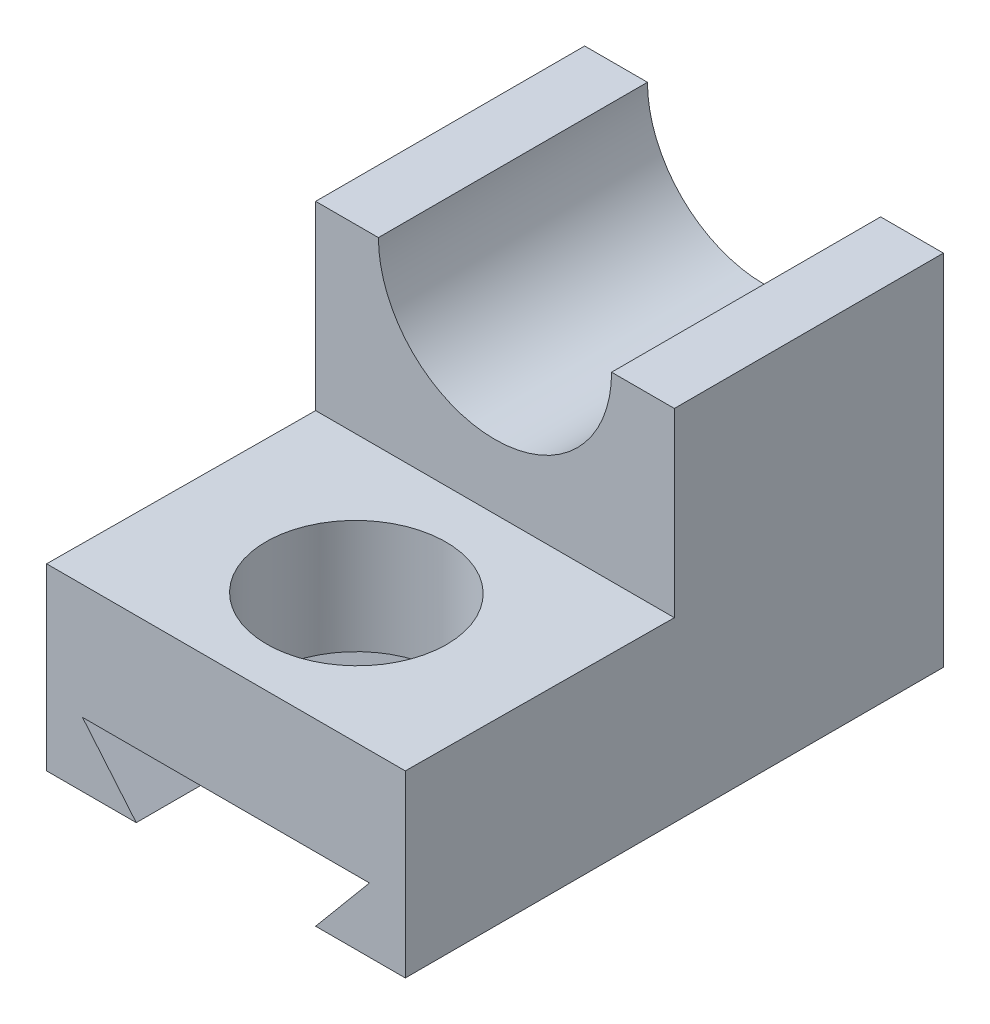
ISO-10303-21;
HEADER;
FILE_DESCRIPTION(('STEP AP214'),'2;1');
FILE_NAME('part.step','',(''),(''),'','','');
FILE_SCHEMA(('AUTOMOTIVE_DESIGN { 1 0 10303 214 1 1 1 1 }'));
ENDSEC;
DATA;
#1=APPLICATION_CONTEXT('core data for automotive mechanical design processes');
#2=APPLICATION_PROTOCOL_DEFINITION('international standard','automotive_design',2000,#1);
#3=PRODUCT_CONTEXT('',#1,'mechanical');
#4=PRODUCT('Part','Part','',(#3));
#5=PRODUCT_RELATED_PRODUCT_CATEGORY('part','',(#4));
#6=PRODUCT_DEFINITION_FORMATION('','',#4);
#7=PRODUCT_DEFINITION_CONTEXT('part definition',#1,'design');
#8=PRODUCT_DEFINITION('design','',#6,#7);
#9=PRODUCT_DEFINITION_SHAPE('','',#8);
#10=(LENGTH_UNIT() NAMED_UNIT(*) SI_UNIT(.MILLI.,.METRE.));
#11=(NAMED_UNIT(*) PLANE_ANGLE_UNIT() SI_UNIT($,.RADIAN.));
#12=(NAMED_UNIT(*) SI_UNIT($,.STERADIAN.) SOLID_ANGLE_UNIT());
#13=UNCERTAINTY_MEASURE_WITH_UNIT(LENGTH_MEASURE(1.E-05),#10,'distance_accuracy_value','');
#14=(GEOMETRIC_REPRESENTATION_CONTEXT(3) GLOBAL_UNCERTAINTY_ASSIGNED_CONTEXT((#13)) GLOBAL_UNIT_ASSIGNED_CONTEXT((#10,
#11,#12)) REPRESENTATION_CONTEXT('',''));
#15=CARTESIAN_POINT('',(0.,0.,0.));
#16=DIRECTION('',(0.,0.,1.));
#17=DIRECTION('',(1.,0.,0.));
#18=AXIS2_PLACEMENT_3D('',#15,#16,#17);
#19=CARTESIAN_POINT('',(508.,-508.,761.999999999975));
#20=DIRECTION('',(0.,1.,0.));
#21=DIRECTION('',(0.,0.,1.));
#22=AXIS2_PLACEMENT_3D('',#19,#20,#21);
#23=PLANE('',#22);
#24=DIRECTION('',(-1.,0.,0.));
#25=VECTOR('',#24,1.);
#26=CARTESIAN_POINT('',(508.,-508.,-762.));
#27=LINE('',#26,#25);
#28=CARTESIAN_POINT('',(-254.,-508.,-762.));
#29=VERTEX_POINT('',#28);
#30=CARTESIAN_POINT('',(-508.,-508.,-762.));
#31=VERTEX_POINT('',#30);
#32=EDGE_CURVE('E172',#29,#31,#27,.T.);
#33=ORIENTED_EDGE('',*,*,#32,.F.);
#34=DIRECTION('',(0.,0.,1.));
#35=VECTOR('',#34,1.);
#36=CARTESIAN_POINT('',(-254.,-508.,-762.));
#37=LINE('',#36,#35);
#38=CARTESIAN_POINT('',(-254.,-508.,392.691654486009));
#39=VERTEX_POINT('',#38);
#40=EDGE_CURVE('E143',#29,#39,#37,.T.);
#41=ORIENTED_EDGE('',*,*,#40,.T.);
#42=CARTESIAN_POINT('',(-254.,-508.,761.999999999975));
#43=VERTEX_POINT('',#42);
#44=EDGE_CURVE('E59',#39,#43,#37,.T.);
#45=ORIENTED_EDGE('',*,*,#44,.T.);
#46=DIRECTION('',(-1.,0.,0.));
#47=VECTOR('',#46,1.);
#48=CARTESIAN_POINT('',(508.,-508.,761.999999999975));
#49=LINE('',#48,#47);
#50=CARTESIAN_POINT('',(-508.,-508.,761.999999999975));
#51=VERTEX_POINT('',#50);
#52=EDGE_CURVE('E141',#43,#51,#49,.T.);
#53=ORIENTED_EDGE('',*,*,#52,.T.);
#54=DIRECTION('',(0.,0.,-1.));
#55=VECTOR('',#54,1.);
#56=CARTESIAN_POINT('',(-508.,-508.,761.999999999975));
#57=LINE('',#56,#55);
#58=EDGE_CURVE('E220',#51,#31,#57,.T.);
#59=ORIENTED_EDGE('',*,*,#58,.T.);
#60=EDGE_LOOP('',(#33,#41,#45,#53,#59));
#61=FACE_BOUND('',#60,.T.);
#62=ADVANCED_FACE('F43',(#61),#23,.F.);
#63=CARTESIAN_POINT('',(508.,508.,-1.19904086659517E-11));
#64=DIRECTION('',(0.,-1.,0.));
#65=DIRECTION('',(0.,0.,-1.));
#66=AXIS2_PLACEMENT_3D('',#63,#64,#65);
#67=PLANE('',#66);
#68=DIRECTION('',(-1.,0.,0.));
#69=VECTOR('',#68,1.);
#70=CARTESIAN_POINT('',(508.,508.,-762.));
#71=LINE('',#70,#69);
#72=CARTESIAN_POINT('',(508.,508.,-762.));
#73=VERTEX_POINT('',#72);
#74=CARTESIAN_POINT('',(330.2,508.,-762.));
#75=VERTEX_POINT('',#74);
#76=EDGE_CURVE('E11',#73,#75,#71,.T.);
#77=ORIENTED_EDGE('',*,*,#76,.T.);
#78=DIRECTION('',(0.,0.,1.));
#79=VECTOR('',#78,1.);
#80=CARTESIAN_POINT('',(330.2,508.,-762.));
#81=LINE('',#80,#79);
#82=CARTESIAN_POINT('',(330.2,508.,0.));
#83=VERTEX_POINT('',#82);
#84=EDGE_CURVE('E234',#75,#83,#81,.T.);
#85=ORIENTED_EDGE('',*,*,#84,.T.);
#86=DIRECTION('',(-1.,0.,0.));
#87=VECTOR('',#86,1.);
#88=CARTESIAN_POINT('',(508.,508.,-1.19904086659517E-11));
#89=LINE('',#88,#87);
#90=CARTESIAN_POINT('',(508.,508.,-1.19904086659517E-11));
#91=VERTEX_POINT('',#90);
#92=EDGE_CURVE('E182',#91,#83,#89,.T.);
#93=ORIENTED_EDGE('',*,*,#92,.F.);
#94=DIRECTION('',(0.,0.,1.));
#95=VECTOR('',#94,1.);
#96=CARTESIAN_POINT('',(508.,508.,-1.19904086659517E-11));
#97=LINE('',#96,#95);
#98=EDGE_CURVE('E225',#73,#91,#97,.T.);
#99=ORIENTED_EDGE('',*,*,#98,.F.);
#100=EDGE_LOOP('',(#77,#85,#93,#99));
#101=FACE_BOUND('',#100,.T.);
#102=ADVANCED_FACE('F318',(#101),#67,.F.);
#103=CARTESIAN_POINT('',(508.,508.,-762.));
#104=DIRECTION('',(0.,0.,1.));
#105=DIRECTION('',(0.,-1.,0.));
#106=AXIS2_PLACEMENT_3D('',#103,#104,#105);
#107=PLANE('',#106);
#108=DIRECTION('',(-1.,0.,0.));
#109=VECTOR('',#108,1.);
#110=CARTESIAN_POINT('',(-406.4,-325.779762395787,-762.));
#111=LINE('',#110,#109);
#112=CARTESIAN_POINT('',(406.4,-325.779762395787,-762.));
#113=VERTEX_POINT('',#112);
#114=CARTESIAN_POINT('',(-406.4,-325.779762395787,-762.));
#115=VERTEX_POINT('',#114);
#116=EDGE_CURVE('E145',#113,#115,#111,.T.);
#117=ORIENTED_EDGE('',*,*,#116,.T.);
#118=DIRECTION('',(0.641549303913256,-0.767081801797185,0.));
#119=VECTOR('',#118,1.);
#120=CARTESIAN_POINT('',(-254.,-508.,-762.));
#121=LINE('',#120,#119);
#122=EDGE_CURVE('E277',#115,#29,#121,.T.);
#123=ORIENTED_EDGE('',*,*,#122,.T.);
#124=ORIENTED_EDGE('',*,*,#32,.T.);
#125=DIRECTION('',(0.,1.,0.));
#126=VECTOR('',#125,1.);
#127=CARTESIAN_POINT('',(-508.,508.,-762.));
#128=LINE('',#127,#126);
#129=CARTESIAN_POINT('',(-508.,508.,-762.));
#130=VERTEX_POINT('',#129);
#131=EDGE_CURVE('E208',#31,#130,#128,.T.);
#132=ORIENTED_EDGE('',*,*,#131,.T.);
#133=CARTESIAN_POINT('',(-330.2,508.,-762.));
#134=VERTEX_POINT('',#133);
#135=EDGE_CURVE('E52',#134,#130,#71,.T.);
#136=ORIENTED_EDGE('',*,*,#135,.F.);
#137=CARTESIAN_POINT('',(0.,508.,-762.));
#138=DIRECTION('',(0.,0.,1.));
#139=DIRECTION('',(1.,0.,0.));
#140=AXIS2_PLACEMENT_3D('',#137,#138,#139);
#141=CIRCLE('',#140,330.2);
#142=EDGE_CURVE('E254',#134,#75,#141,.T.);
#143=ORIENTED_EDGE('',*,*,#142,.T.);
#144=ORIENTED_EDGE('',*,*,#76,.F.);
#145=DIRECTION('',(0.,1.,0.));
#146=VECTOR('',#145,1.);
#147=CARTESIAN_POINT('',(508.,508.,-762.));
#148=LINE('',#147,#146);
#149=CARTESIAN_POINT('',(508.,-508.,-762.));
#150=VERTEX_POINT('',#149);
#151=EDGE_CURVE('E222',#150,#73,#148,.T.);
#152=ORIENTED_EDGE('',*,*,#151,.F.);
#153=CARTESIAN_POINT('',(254.,-508.,-762.));
#154=VERTEX_POINT('',#153);
#155=EDGE_CURVE('E166',#150,#154,#27,.T.);
#156=ORIENTED_EDGE('',*,*,#155,.T.);
#157=DIRECTION('',(0.641549303913256,0.767081801797185,0.));
#158=VECTOR('',#157,1.);
#159=CARTESIAN_POINT('',(254.,-508.,-762.));
#160=LINE('',#159,#158);
#161=EDGE_CURVE('E273',#154,#113,#160,.T.);
#162=ORIENTED_EDGE('',*,*,#161,.T.);
#163=EDGE_LOOP('',(#117,#123,#124,#132,#136,#143,#144,#152,#156,#162));
#164=FACE_BOUND('',#163,.T.);
#165=ADVANCED_FACE('F45',(#164),#107,.F.);
#166=CARTESIAN_POINT('',(-330.2,508.,-1.19904086659517E-11));
#167=VERTEX_POINT('',#166);
#168=CARTESIAN_POINT('',(-508.,508.,-1.19904086659517E-11));
#169=VERTEX_POINT('',#168);
#170=EDGE_CURVE('E181',#167,#169,#89,.T.);
#171=ORIENTED_EDGE('',*,*,#170,.F.);
#172=DIRECTION('',(0.,0.,1.));
#173=VECTOR('',#172,1.);
#174=CARTESIAN_POINT('',(-330.2,508.,-762.));
#175=LINE('',#174,#173);
#176=EDGE_CURVE('E248',#134,#167,#175,.T.);
#177=ORIENTED_EDGE('',*,*,#176,.F.);
#178=ORIENTED_EDGE('',*,*,#135,.T.);
#179=DIRECTION('',(0.,0.,1.));
#180=VECTOR('',#179,1.);
#181=CARTESIAN_POINT('',(-508.,508.,-1.19904086659517E-11));
#182=LINE('',#181,#180);
#183=EDGE_CURVE('E201',#130,#169,#182,.T.);
#184=ORIENTED_EDGE('',*,*,#183,.T.);
#185=EDGE_LOOP('',(#171,#177,#178,#184));
#186=FACE_BOUND('',#185,.T.);
#187=ADVANCED_FACE('F202',(#186),#67,.F.);
#188=CARTESIAN_POINT('',(508.,-5.27605419082988,0.));
#189=DIRECTION('',(0.,0.,-1.));
#190=DIRECTION('',(0.,1.,0.));
#191=AXIS2_PLACEMENT_3D('',#188,#189,#190);
#192=PLANE('',#191);
#193=ORIENTED_EDGE('',*,*,#92,.T.);
#194=CARTESIAN_POINT('',(0.,508.,0.));
#195=DIRECTION('',(0.,0.,1.));
#196=DIRECTION('',(1.,0.,0.));
#197=AXIS2_PLACEMENT_3D('',#194,#195,#196);
#198=CIRCLE('',#197,330.2);
#199=EDGE_CURVE('E197',#167,#83,#198,.T.);
#200=ORIENTED_EDGE('',*,*,#199,.F.);
#201=ORIENTED_EDGE('',*,*,#170,.T.);
#202=DIRECTION('',(0.,-1.,0.));
#203=VECTOR('',#202,1.);
#204=CARTESIAN_POINT('',(-508.,-5.27605419082988,0.));
#205=LINE('',#204,#203);
#206=CARTESIAN_POINT('',(-508.,-5.27605419082988,0.));
#207=VERTEX_POINT('',#206);
#208=EDGE_CURVE('E196',#169,#207,#205,.T.);
#209=ORIENTED_EDGE('',*,*,#208,.T.);
#210=DIRECTION('',(-1.,0.,0.));
#211=VECTOR('',#210,1.);
#212=CARTESIAN_POINT('',(508.,-5.27605419082988,0.));
#213=LINE('',#212,#211);
#214=CARTESIAN_POINT('',(508.,-5.27605419082988,0.));
#215=VERTEX_POINT('',#214);
#216=EDGE_CURVE('E178',#215,#207,#213,.T.);
#217=ORIENTED_EDGE('',*,*,#216,.F.);
#218=DIRECTION('',(0.,-1.,0.));
#219=VECTOR('',#218,1.);
#220=CARTESIAN_POINT('',(508.,-5.27605419082988,0.));
#221=LINE('',#220,#219);
#222=EDGE_CURVE('E231',#91,#215,#221,.T.);
#223=ORIENTED_EDGE('',*,*,#222,.F.);
#224=EDGE_LOOP('',(#193,#200,#201,#209,#217,#223));
#225=FACE_BOUND('',#224,.T.);
#226=ADVANCED_FACE('F193',(#225),#192,.F.);
#227=CARTESIAN_POINT('',(508.,0.,761.999999999975));
#228=DIRECTION('',(0.,-0.999976030281059,0.00692378966574013));
#229=DIRECTION('',(0.,-0.00692378966574013,-0.999976030281059));
#230=AXIS2_PLACEMENT_3D('',#227,#228,#229);
#231=PLANE('',#230);
#232=CARTESIAN_POINT('',(0.,-2.55707459850074,392.691654486009));
#233=DIRECTION('',(0.,-0.999976030281059,0.00692378966574013));
#234=DIRECTION('',(0.,0.00692378966574013,0.999976030281059));
#235=AXIS2_PLACEMENT_3D('',#232,#233,#234);
#236=ELLIPSE('',#235,254.00608845455,254.);
#237=CARTESIAN_POINT('',(0.,-0.798389868224057,646.691654486009));
#238=VERTEX_POINT('',#237);
#239=EDGE_CURVE('E157',#238,#238,#236,.T.);
#240=ORIENTED_EDGE('',*,*,#239,.T.);
#241=EDGE_LOOP('',(#240));
#242=FACE_BOUND('',#241,.T.);
#243=DIRECTION('',(0.,0.00692378966574013,0.999976030281059));
#244=VECTOR('',#243,1.);
#245=CARTESIAN_POINT('',(-508.,0.,761.999999999975));
#246=LINE('',#245,#244);
#247=CARTESIAN_POINT('',(-508.,0.,761.999999999975));
#248=VERTEX_POINT('',#247);
#249=EDGE_CURVE('E212',#207,#248,#246,.T.);
#250=ORIENTED_EDGE('',*,*,#249,.T.);
#251=DIRECTION('',(-1.,0.,0.));
#252=VECTOR('',#251,1.);
#253=CARTESIAN_POINT('',(508.,0.,761.999999999975));
#254=LINE('',#253,#252);
#255=CARTESIAN_POINT('',(508.,0.,761.999999999975));
#256=VERTEX_POINT('',#255);
#257=EDGE_CURVE('E170',#256,#248,#254,.T.);
#258=ORIENTED_EDGE('',*,*,#257,.F.);
#259=DIRECTION('',(0.,0.00692378966574013,0.999976030281059));
#260=VECTOR('',#259,1.);
#261=CARTESIAN_POINT('',(508.,0.,761.999999999975));
#262=LINE('',#261,#260);
#263=EDGE_CURVE('E239',#215,#256,#262,.T.);
#264=ORIENTED_EDGE('',*,*,#263,.F.);
#265=ORIENTED_EDGE('',*,*,#216,.T.);
#266=EDGE_LOOP('',(#250,#258,#264,#265));
#267=FACE_BOUND('',#266,.T.);
#268=ADVANCED_FACE('F305',(#242,#267),#231,.F.);
#269=CARTESIAN_POINT('',(508.,0.,761.999999999975));
#270=DIRECTION('',(0.,0.,-1.));
#271=DIRECTION('',(0.,1.,0.));
#272=AXIS2_PLACEMENT_3D('',#269,#270,#271);
#273=PLANE('',#272);
#274=ORIENTED_EDGE('',*,*,#52,.F.);
#275=DIRECTION('',(0.641549303913256,-0.767081801797185,0.));
#276=VECTOR('',#275,1.);
#277=CARTESIAN_POINT('',(-254.,-508.,761.999999999975));
#278=LINE('',#277,#276);
#279=CARTESIAN_POINT('',(-406.4,-325.779762395787,761.999999999975));
#280=VERTEX_POINT('',#279);
#281=EDGE_CURVE('E148',#280,#43,#278,.T.);
#282=ORIENTED_EDGE('',*,*,#281,.F.);
#283=DIRECTION('',(-1.,0.,0.));
#284=VECTOR('',#283,1.);
#285=CARTESIAN_POINT('',(-406.4,-325.779762395787,761.999999999975));
#286=LINE('',#285,#284);
#287=CARTESIAN_POINT('',(406.4,-325.779762395787,761.999999999975));
#288=VERTEX_POINT('',#287);
#289=EDGE_CURVE('E281',#288,#280,#286,.T.);
#290=ORIENTED_EDGE('',*,*,#289,.F.);
#291=DIRECTION('',(0.641549303913256,0.767081801797185,0.));
#292=VECTOR('',#291,1.);
#293=CARTESIAN_POINT('',(254.,-508.,761.999999999975));
#294=LINE('',#293,#292);
#295=CARTESIAN_POINT('',(254.,-508.,761.999999999975));
#296=VERTEX_POINT('',#295);
#297=EDGE_CURVE('E156',#296,#288,#294,.T.);
#298=ORIENTED_EDGE('',*,*,#297,.F.);
#299=CARTESIAN_POINT('',(508.,-508.,761.999999999975));
#300=VERTEX_POINT('',#299);
#301=EDGE_CURVE('E165',#300,#296,#49,.T.);
#302=ORIENTED_EDGE('',*,*,#301,.F.);
#303=DIRECTION('',(0.,-1.,0.));
#304=VECTOR('',#303,1.);
#305=CARTESIAN_POINT('',(508.,0.,761.999999999975));
#306=LINE('',#305,#304);
#307=EDGE_CURVE('E242',#256,#300,#306,.T.);
#308=ORIENTED_EDGE('',*,*,#307,.F.);
#309=ORIENTED_EDGE('',*,*,#257,.T.);
#310=DIRECTION('',(0.,-1.,0.));
#311=VECTOR('',#310,1.);
#312=CARTESIAN_POINT('',(-508.,0.,761.999999999975));
#313=LINE('',#312,#311);
#314=EDGE_CURVE('E162',#248,#51,#313,.T.);
#315=ORIENTED_EDGE('',*,*,#314,.T.);
#316=EDGE_LOOP('',(#274,#282,#290,#298,#302,#308,#309,#315));
#317=FACE_BOUND('',#316,.T.);
#318=ADVANCED_FACE('F159',(#317),#273,.F.);
#319=ORIENTED_EDGE('',*,*,#301,.T.);
#320=DIRECTION('',(0.,0.,1.));
#321=VECTOR('',#320,1.);
#322=CARTESIAN_POINT('',(254.,-508.,-762.));
#323=LINE('',#322,#321);
#324=CARTESIAN_POINT('',(254.,-508.,392.691654486009));
#325=VERTEX_POINT('',#324);
#326=EDGE_CURVE('E67',#325,#296,#323,.T.);
#327=ORIENTED_EDGE('',*,*,#326,.F.);
#328=EDGE_CURVE('E262',#154,#325,#323,.T.);
#329=ORIENTED_EDGE('',*,*,#328,.F.);
#330=ORIENTED_EDGE('',*,*,#155,.F.);
#331=DIRECTION('',(0.,0.,-1.));
#332=VECTOR('',#331,1.);
#333=CARTESIAN_POINT('',(508.,-508.,761.999999999975));
#334=LINE('',#333,#332);
#335=EDGE_CURVE('E245',#300,#150,#334,.T.);
#336=ORIENTED_EDGE('',*,*,#335,.F.);
#337=EDGE_LOOP('',(#319,#327,#329,#330,#336));
#338=FACE_BOUND('',#337,.T.);
#339=ADVANCED_FACE('F320',(#338),#23,.F.);
#340=CARTESIAN_POINT('',(508.,0.,0.));
#341=DIRECTION('',(1.,0.,0.));
#342=DIRECTION('',(0.,0.,-1.));
#343=AXIS2_PLACEMENT_3D('',#340,#341,#342);
#344=PLANE('',#343);
#345=ORIENTED_EDGE('',*,*,#151,.T.);
#346=ORIENTED_EDGE('',*,*,#98,.T.);
#347=ORIENTED_EDGE('',*,*,#222,.T.);
#348=ORIENTED_EDGE('',*,*,#263,.T.);
#349=ORIENTED_EDGE('',*,*,#307,.T.);
#350=ORIENTED_EDGE('',*,*,#335,.T.);
#351=EDGE_LOOP('',(#345,#346,#347,#348,#349,#350));
#352=FACE_BOUND('',#351,.T.);
#353=ADVANCED_FACE('F315',(#352),#344,.T.);
#354=CARTESIAN_POINT('',(-508.,0.,0.));
#355=DIRECTION('',(1.,0.,0.));
#356=DIRECTION('',(0.,0.,-1.));
#357=AXIS2_PLACEMENT_3D('',#354,#355,#356);
#358=PLANE('',#357);
#359=ORIENTED_EDGE('',*,*,#131,.F.);
#360=ORIENTED_EDGE('',*,*,#58,.F.);
#361=ORIENTED_EDGE('',*,*,#314,.F.);
#362=ORIENTED_EDGE('',*,*,#249,.F.);
#363=ORIENTED_EDGE('',*,*,#208,.F.);
#364=ORIENTED_EDGE('',*,*,#183,.F.);
#365=EDGE_LOOP('',(#359,#360,#361,#362,#363,#364));
#366=FACE_BOUND('',#365,.T.);
#367=ADVANCED_FACE('F211',(#366),#358,.F.);
#368=CARTESIAN_POINT('',(0.,508.,-762.));
#369=DIRECTION('',(0.,0.,1.));
#370=DIRECTION('',(1.,0.,0.));
#371=AXIS2_PLACEMENT_3D('',#368,#369,#370);
#372=CYLINDRICAL_SURFACE('',#371,330.2);
#373=ORIENTED_EDGE('',*,*,#199,.T.);
#374=ORIENTED_EDGE('',*,*,#84,.F.);
#375=ORIENTED_EDGE('',*,*,#142,.F.);
#376=ORIENTED_EDGE('',*,*,#176,.T.);
#377=EDGE_LOOP('',(#373,#374,#375,#376));
#378=FACE_BOUND('',#377,.T.);
#379=ADVANCED_FACE('F319',(#378),#372,.F.);
#380=CARTESIAN_POINT('',(-254.,-508.,-762.));
#381=DIRECTION('',(-0.767081801797185,-0.641549303913256,0.));
#382=DIRECTION('',(0.641549303913256,-0.767081801797185,0.));
#383=AXIS2_PLACEMENT_3D('',#380,#381,#382);
#384=PLANE('',#383);
#385=ORIENTED_EDGE('',*,*,#40,.F.);
#386=ORIENTED_EDGE('',*,*,#122,.F.);
#387=DIRECTION('',(0.,0.,1.));
#388=VECTOR('',#387,1.);
#389=CARTESIAN_POINT('',(-406.4,-325.779762395787,-762.));
#390=LINE('',#389,#388);
#391=EDGE_CURVE('E151',#115,#280,#390,.T.);
#392=ORIENTED_EDGE('',*,*,#391,.T.);
#393=ORIENTED_EDGE('',*,*,#281,.T.);
#394=ORIENTED_EDGE('',*,*,#44,.F.);
#395=EDGE_LOOP('',(#385,#386,#392,#393,#394));
#396=FACE_BOUND('',#395,.T.);
#397=ADVANCED_FACE('F149',(#396),#384,.F.);
#398=CARTESIAN_POINT('',(-406.4,-325.779762395787,-762.));
#399=DIRECTION('',(0.,1.,0.));
#400=DIRECTION('',(0.,0.,1.));
#401=AXIS2_PLACEMENT_3D('',#398,#399,#400);
#402=PLANE('',#401);
#403=CARTESIAN_POINT('',(0.,-325.779762395787,392.691654486009));
#404=DIRECTION('',(0.,1.,0.));
#405=DIRECTION('',(0.,0.,1.));
#406=AXIS2_PLACEMENT_3D('',#403,#404,#405);
#407=CIRCLE('',#406,254.);
#408=CARTESIAN_POINT('',(0.,-325.779762395787,646.691654486009));
#409=VERTEX_POINT('',#408);
#410=EDGE_CURVE('E290',#409,#409,#407,.T.);
#411=ORIENTED_EDGE('',*,*,#410,.T.);
#412=EDGE_LOOP('',(#411));
#413=FACE_BOUND('',#412,.T.);
#414=ORIENTED_EDGE('',*,*,#391,.F.);
#415=ORIENTED_EDGE('',*,*,#116,.F.);
#416=DIRECTION('',(0.,0.,1.));
#417=VECTOR('',#416,1.);
#418=CARTESIAN_POINT('',(406.4,-325.779762395787,-762.));
#419=LINE('',#418,#417);
#420=EDGE_CURVE('E265',#113,#288,#419,.T.);
#421=ORIENTED_EDGE('',*,*,#420,.T.);
#422=ORIENTED_EDGE('',*,*,#289,.T.);
#423=EDGE_LOOP('',(#414,#415,#421,#422));
#424=FACE_BOUND('',#423,.T.);
#425=ADVANCED_FACE('F295',(#413,#424),#402,.F.);
#426=CARTESIAN_POINT('',(254.,-508.,-762.));
#427=DIRECTION('',(0.767081801797185,-0.641549303913256,0.));
#428=DIRECTION('',(0.641549303913256,0.767081801797185,0.));
#429=AXIS2_PLACEMENT_3D('',#426,#427,#428);
#430=PLANE('',#429);
#431=ORIENTED_EDGE('',*,*,#420,.F.);
#432=ORIENTED_EDGE('',*,*,#161,.F.);
#433=ORIENTED_EDGE('',*,*,#328,.T.);
#434=ORIENTED_EDGE('',*,*,#326,.T.);
#435=ORIENTED_EDGE('',*,*,#297,.T.);
#436=EDGE_LOOP('',(#431,#432,#433,#434,#435));
#437=FACE_BOUND('',#436,.T.);
#438=ADVANCED_FACE('F301',(#437),#430,.F.);
#439=CARTESIAN_POINT('',(0.,-508.,392.691654486009));
#440=DIRECTION('',(0.,1.,0.));
#441=DIRECTION('',(0.,0.,1.));
#442=AXIS2_PLACEMENT_3D('',#439,#440,#441);
#443=CYLINDRICAL_SURFACE('',#442,254.);
#444=ORIENTED_EDGE('',*,*,#410,.F.);
#445=EDGE_LOOP('',(#444));
#446=FACE_BOUND('',#445,.T.);
#447=ORIENTED_EDGE('',*,*,#239,.F.);
#448=EDGE_LOOP('',(#447));
#449=FACE_BOUND('',#448,.T.);
#450=ADVANCED_FACE('F298',(#446,#449),#443,.F.);
#451=CLOSED_SHELL('',(#62,#102,#165,#187,#226,#268,#318,#339,#353,#367,#379,#397,#425,#438,#450));
#452=MANIFOLD_SOLID_BREP('B2',#451);
#453=ADVANCED_BREP_SHAPE_REPRESENTATION('',(#18,#452),#14);
#454=SHAPE_DEFINITION_REPRESENTATION(#9,#453);
ENDSEC;
END-ISO-10303-21;
